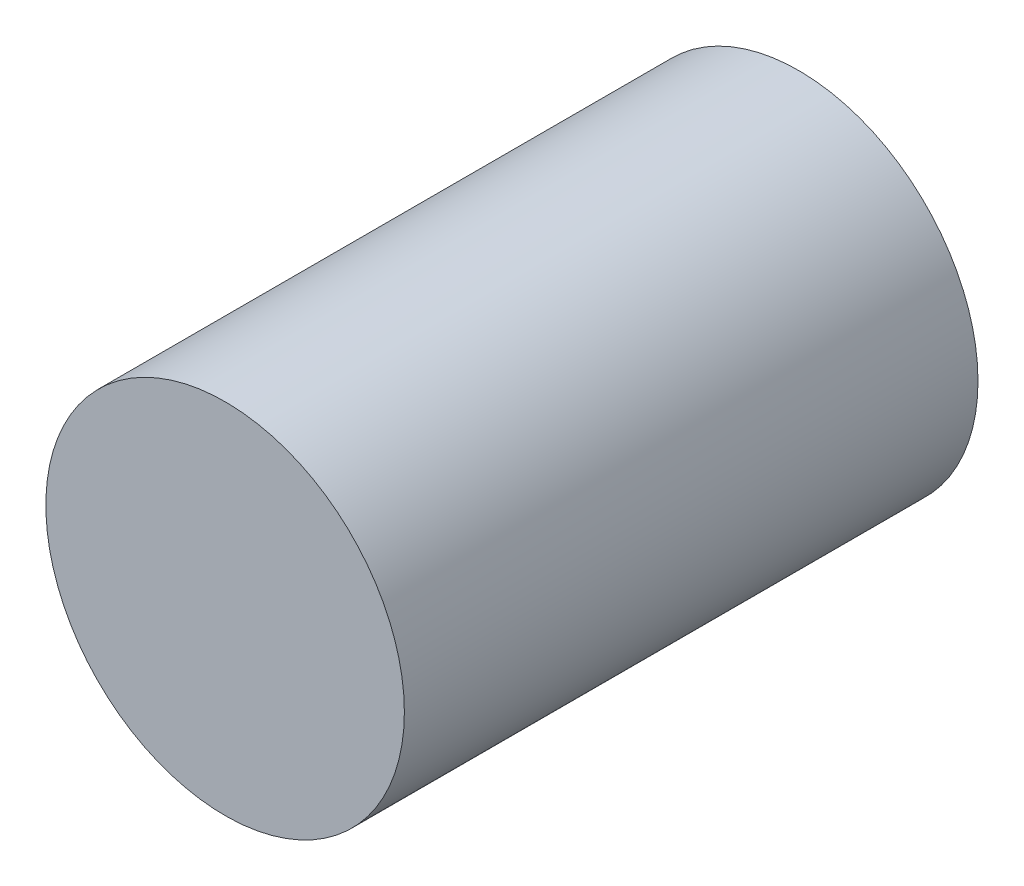
ISO-10303-21;
HEADER;
FILE_DESCRIPTION(('STEP AP214'),'2;1');
FILE_NAME('part.step','',(''),(''),'','','');
FILE_SCHEMA(('AUTOMOTIVE_DESIGN { 1 0 10303 214 1 1 1 1 }'));
ENDSEC;
DATA;
#1=APPLICATION_CONTEXT('core data for automotive mechanical design processes');
#2=APPLICATION_PROTOCOL_DEFINITION('international standard','automotive_design',2000,#1);
#3=PRODUCT_CONTEXT('',#1,'mechanical');
#4=PRODUCT('Part','Part','',(#3));
#5=PRODUCT_RELATED_PRODUCT_CATEGORY('part','',(#4));
#6=PRODUCT_DEFINITION_FORMATION('','',#4);
#7=PRODUCT_DEFINITION_CONTEXT('part definition',#1,'design');
#8=PRODUCT_DEFINITION('design','',#6,#7);
#9=PRODUCT_DEFINITION_SHAPE('','',#8);
#10=(LENGTH_UNIT() NAMED_UNIT(*) SI_UNIT(.MILLI.,.METRE.));
#11=(NAMED_UNIT(*) PLANE_ANGLE_UNIT() SI_UNIT($,.RADIAN.));
#12=(NAMED_UNIT(*) SI_UNIT($,.STERADIAN.) SOLID_ANGLE_UNIT());
#13=UNCERTAINTY_MEASURE_WITH_UNIT(LENGTH_MEASURE(1.E-05),#10,'distance_accuracy_value','');
#14=(GEOMETRIC_REPRESENTATION_CONTEXT(3) GLOBAL_UNCERTAINTY_ASSIGNED_CONTEXT((#13)) GLOBAL_UNIT_ASSIGNED_CONTEXT((#10,
#11,#12)) REPRESENTATION_CONTEXT('',''));
#15=CARTESIAN_POINT('',(0.,0.,0.));
#16=DIRECTION('',(0.,0.,1.));
#17=DIRECTION('',(1.,0.,0.));
#18=AXIS2_PLACEMENT_3D('',#15,#16,#17);
#19=CARTESIAN_POINT('',(0.,0.,16.));
#20=DIRECTION('',(0.,0.,-1.));
#21=DIRECTION('',(-1.,0.,0.));
#22=AXIS2_PLACEMENT_3D('',#19,#20,#21);
#23=CYLINDRICAL_SURFACE('',#22,5.);
#24=CARTESIAN_POINT('',(0.,0.,16.));
#25=DIRECTION('',(0.,0.,1.));
#26=DIRECTION('',(1.,0.,0.));
#27=AXIS2_PLACEMENT_3D('',#24,#25,#26);
#28=CIRCLE('',#27,5.);
#29=CARTESIAN_POINT('',(5.,0.,16.));
#30=VERTEX_POINT('',#29);
#31=EDGE_CURVE('E10',#30,#30,#28,.T.);
#32=ORIENTED_EDGE('',*,*,#31,.F.);
#33=EDGE_LOOP('',(#32));
#34=FACE_BOUND('',#33,.T.);
#35=CARTESIAN_POINT('',(0.,0.,0.));
#36=DIRECTION('',(0.,0.,1.));
#37=DIRECTION('',(1.,0.,0.));
#38=AXIS2_PLACEMENT_3D('',#35,#36,#37);
#39=CIRCLE('',#38,5.);
#40=CARTESIAN_POINT('',(5.,0.,0.));
#41=VERTEX_POINT('',#40);
#42=EDGE_CURVE('E34',#41,#41,#39,.T.);
#43=ORIENTED_EDGE('',*,*,#42,.T.);
#44=EDGE_LOOP('',(#43));
#45=FACE_BOUND('',#44,.T.);
#46=ADVANCED_FACE('F31',(#34,#45),#23,.T.);
#47=CARTESIAN_POINT('',(0.,0.,16.));
#48=DIRECTION('',(0.,0.,1.));
#49=DIRECTION('',(1.,0.,0.));
#50=AXIS2_PLACEMENT_3D('',#47,#48,#49);
#51=PLANE('',#50);
#52=ORIENTED_EDGE('',*,*,#31,.T.);
#53=EDGE_LOOP('',(#52));
#54=FACE_BOUND('',#53,.T.);
#55=ADVANCED_FACE('F46',(#54),#51,.T.);
#56=CARTESIAN_POINT('',(0.,0.,0.));
#57=DIRECTION('',(0.,0.,1.));
#58=DIRECTION('',(1.,0.,0.));
#59=AXIS2_PLACEMENT_3D('',#56,#57,#58);
#60=PLANE('',#59);
#61=ORIENTED_EDGE('',*,*,#42,.F.);
#62=EDGE_LOOP('',(#61));
#63=FACE_BOUND('',#62,.T.);
#64=ADVANCED_FACE('F44',(#63),#60,.F.);
#65=CLOSED_SHELL('',(#46,#55,#64));
#66=MANIFOLD_SOLID_BREP('B2',#65);
#67=ADVANCED_BREP_SHAPE_REPRESENTATION('',(#18,#66),#14);
#68=SHAPE_DEFINITION_REPRESENTATION(#9,#67);
ENDSEC;
END-ISO-10303-21;
